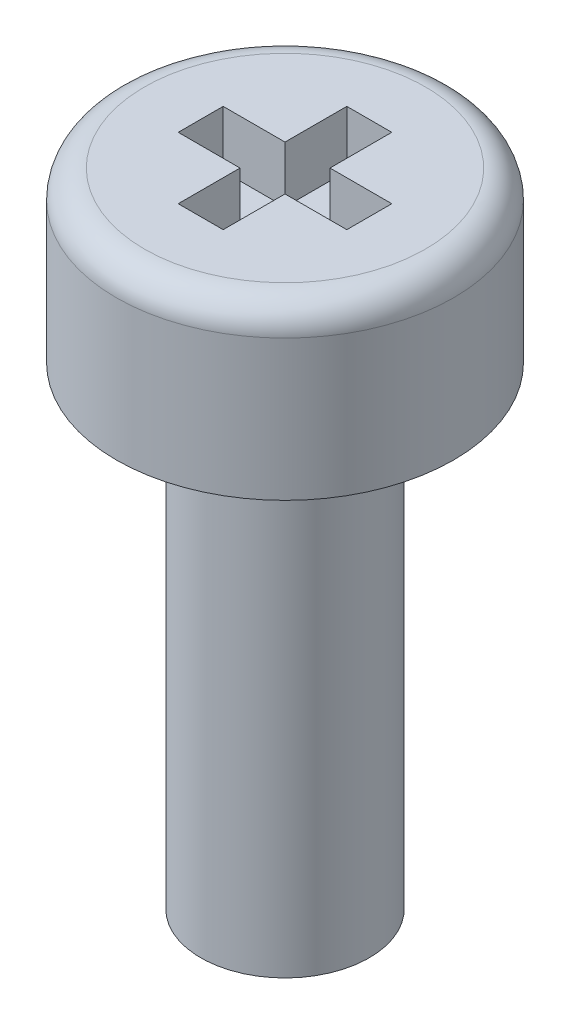
ISO-10303-21;
HEADER;
FILE_DESCRIPTION(('STEP AP214'),'2;1');
FILE_NAME('part.step','',(''),(''),'','','');
FILE_SCHEMA(('AUTOMOTIVE_DESIGN { 1 0 10303 214 1 1 1 1 }'));
ENDSEC;
DATA;
#1=APPLICATION_CONTEXT('core data for automotive mechanical design processes');
#2=APPLICATION_PROTOCOL_DEFINITION('international standard','automotive_design',2000,#1);
#3=PRODUCT_CONTEXT('',#1,'mechanical');
#4=PRODUCT('Part','Part','',(#3));
#5=PRODUCT_RELATED_PRODUCT_CATEGORY('part','',(#4));
#6=PRODUCT_DEFINITION_FORMATION('','',#4);
#7=PRODUCT_DEFINITION_CONTEXT('part definition',#1,'design');
#8=PRODUCT_DEFINITION('design','',#6,#7);
#9=PRODUCT_DEFINITION_SHAPE('','',#8);
#10=(LENGTH_UNIT() NAMED_UNIT(*) SI_UNIT(.MILLI.,.METRE.));
#11=(NAMED_UNIT(*) PLANE_ANGLE_UNIT() SI_UNIT($,.RADIAN.));
#12=(NAMED_UNIT(*) SI_UNIT($,.STERADIAN.) SOLID_ANGLE_UNIT());
#13=UNCERTAINTY_MEASURE_WITH_UNIT(LENGTH_MEASURE(1.E-05),#10,'distance_accuracy_value','');
#14=(GEOMETRIC_REPRESENTATION_CONTEXT(3) GLOBAL_UNCERTAINTY_ASSIGNED_CONTEXT((#13)) GLOBAL_UNIT_ASSIGNED_CONTEXT((#10,
#11,#12)) REPRESENTATION_CONTEXT('',''));
#15=CARTESIAN_POINT('',(0.,0.,0.));
#16=DIRECTION('',(0.,0.,1.));
#17=DIRECTION('',(1.,0.,0.));
#18=AXIS2_PLACEMENT_3D('',#15,#16,#17);
#19=CARTESIAN_POINT('',(0.,3.,0.));
#20=DIRECTION('',(0.,-1.,0.));
#21=DIRECTION('',(0.,0.,-1.));
#22=AXIS2_PLACEMENT_3D('',#19,#20,#21);
#23=CYLINDRICAL_SURFACE('',#22,3.);
#24=CARTESIAN_POINT('',(0.,2.5,0.));
#25=DIRECTION('',(0.,1.,0.));
#26=DIRECTION('',(0.,0.,1.));
#27=AXIS2_PLACEMENT_3D('',#24,#25,#26);
#28=CIRCLE('',#27,3.);
#29=CARTESIAN_POINT('',(0.,2.5,3.));
#30=VERTEX_POINT('',#29);
#31=EDGE_CURVE('E11',#30,#30,#28,.F.);
#32=ORIENTED_EDGE('',*,*,#31,.T.);
#33=EDGE_LOOP('',(#32));
#34=FACE_BOUND('',#33,.T.);
#35=CARTESIAN_POINT('',(0.,0.,0.));
#36=DIRECTION('',(0.,1.,0.));
#37=DIRECTION('',(0.,0.,1.));
#38=AXIS2_PLACEMENT_3D('',#35,#36,#37);
#39=CIRCLE('',#38,3.);
#40=CARTESIAN_POINT('',(0.,0.,3.));
#41=VERTEX_POINT('',#40);
#42=EDGE_CURVE('E211',#41,#41,#39,.T.);
#43=ORIENTED_EDGE('',*,*,#42,.T.);
#44=EDGE_LOOP('',(#43));
#45=FACE_BOUND('',#44,.T.);
#46=ADVANCED_FACE('F33',(#34,#45),#23,.T.);
#47=CARTESIAN_POINT('',(0.,3.,0.));
#48=DIRECTION('',(0.,1.,0.));
#49=DIRECTION('',(0.,0.,1.));
#50=AXIS2_PLACEMENT_3D('',#47,#48,#49);
#51=PLANE('',#50);
#52=DIRECTION('',(0.,0.,1.));
#53=VECTOR('',#52,1.);
#54=CARTESIAN_POINT('',(-0.4,3.,0.));
#55=LINE('',#54,#53);
#56=CARTESIAN_POINT('',(-0.4,3.,-1.5));
#57=VERTEX_POINT('',#56);
#58=CARTESIAN_POINT('',(-0.4,3.,-0.4));
#59=VERTEX_POINT('',#58);
#60=EDGE_CURVE('E48',#57,#59,#55,.T.);
#61=ORIENTED_EDGE('',*,*,#60,.F.);
#62=DIRECTION('',(-1.,0.,0.));
#63=VECTOR('',#62,1.);
#64=CARTESIAN_POINT('',(0.,3.,-1.5));
#65=LINE('',#64,#63);
#66=CARTESIAN_POINT('',(0.4,3.,-1.5));
#67=VERTEX_POINT('',#66);
#68=EDGE_CURVE('E187',#67,#57,#65,.T.);
#69=ORIENTED_EDGE('',*,*,#68,.F.);
#70=DIRECTION('',(0.,0.,1.));
#71=VECTOR('',#70,1.);
#72=CARTESIAN_POINT('',(0.4,3.,0.));
#73=LINE('',#72,#71);
#74=CARTESIAN_POINT('',(0.4,3.,-0.4));
#75=VERTEX_POINT('',#74);
#76=EDGE_CURVE('E185',#67,#75,#73,.T.);
#77=ORIENTED_EDGE('',*,*,#76,.T.);
#78=DIRECTION('',(1.,0.,0.));
#79=VECTOR('',#78,1.);
#80=CARTESIAN_POINT('',(0.,3.,-0.4));
#81=LINE('',#80,#79);
#82=CARTESIAN_POINT('',(1.5,3.,-0.4));
#83=VERTEX_POINT('',#82);
#84=EDGE_CURVE('E143',#75,#83,#81,.T.);
#85=ORIENTED_EDGE('',*,*,#84,.T.);
#86=DIRECTION('',(0.,0.,1.));
#87=VECTOR('',#86,1.);
#88=CARTESIAN_POINT('',(1.5,3.,0.));
#89=LINE('',#88,#87);
#90=CARTESIAN_POINT('',(1.5,3.,0.4));
#91=VERTEX_POINT('',#90);
#92=EDGE_CURVE('E181',#83,#91,#89,.T.);
#93=ORIENTED_EDGE('',*,*,#92,.T.);
#94=DIRECTION('',(1.,0.,0.));
#95=VECTOR('',#94,1.);
#96=CARTESIAN_POINT('',(0.,3.,0.4));
#97=LINE('',#96,#95);
#98=CARTESIAN_POINT('',(0.4,3.,0.4));
#99=VERTEX_POINT('',#98);
#100=EDGE_CURVE('E178',#99,#91,#97,.T.);
#101=ORIENTED_EDGE('',*,*,#100,.F.);
#102=DIRECTION('',(0.,0.,1.));
#103=VECTOR('',#102,1.);
#104=CARTESIAN_POINT('',(0.4,3.,0.));
#105=LINE('',#104,#103);
#106=CARTESIAN_POINT('',(0.4,3.,1.5));
#107=VERTEX_POINT('',#106);
#108=EDGE_CURVE('E175',#99,#107,#105,.T.);
#109=ORIENTED_EDGE('',*,*,#108,.T.);
#110=DIRECTION('',(-1.,0.,0.));
#111=VECTOR('',#110,1.);
#112=CARTESIAN_POINT('',(0.,3.,1.5));
#113=LINE('',#112,#111);
#114=CARTESIAN_POINT('',(-0.4,3.,1.5));
#115=VERTEX_POINT('',#114);
#116=EDGE_CURVE('E172',#107,#115,#113,.T.);
#117=ORIENTED_EDGE('',*,*,#116,.T.);
#118=DIRECTION('',(0.,0.,1.));
#119=VECTOR('',#118,1.);
#120=CARTESIAN_POINT('',(-0.4,3.,0.));
#121=LINE('',#120,#119);
#122=CARTESIAN_POINT('',(-0.4,3.,0.4));
#123=VERTEX_POINT('',#122);
#124=EDGE_CURVE('E169',#123,#115,#121,.T.);
#125=ORIENTED_EDGE('',*,*,#124,.F.);
#126=DIRECTION('',(1.,0.,0.));
#127=VECTOR('',#126,1.);
#128=CARTESIAN_POINT('',(0.,3.,0.4));
#129=LINE('',#128,#127);
#130=CARTESIAN_POINT('',(-1.5,3.,0.4));
#131=VERTEX_POINT('',#130);
#132=EDGE_CURVE('E166',#131,#123,#129,.T.);
#133=ORIENTED_EDGE('',*,*,#132,.F.);
#134=DIRECTION('',(0.,0.,1.));
#135=VECTOR('',#134,1.);
#136=CARTESIAN_POINT('',(-1.5,3.,0.));
#137=LINE('',#136,#135);
#138=CARTESIAN_POINT('',(-1.5,3.,-0.4));
#139=VERTEX_POINT('',#138);
#140=EDGE_CURVE('E163',#139,#131,#137,.T.);
#141=ORIENTED_EDGE('',*,*,#140,.F.);
#142=DIRECTION('',(1.,0.,0.));
#143=VECTOR('',#142,1.);
#144=CARTESIAN_POINT('',(0.,3.,-0.4));
#145=LINE('',#144,#143);
#146=EDGE_CURVE('E160',#139,#59,#145,.T.);
#147=ORIENTED_EDGE('',*,*,#146,.T.);
#148=EDGE_LOOP('',(#61,#69,#77,#85,#93,#101,#109,#117,#125,#133,#141,#147));
#149=FACE_BOUND('',#148,.T.);
#150=CARTESIAN_POINT('',(0.,3.,0.));
#151=DIRECTION('',(0.,1.,0.));
#152=DIRECTION('',(0.,0.,1.));
#153=AXIS2_PLACEMENT_3D('',#150,#151,#152);
#154=CIRCLE('',#153,2.5);
#155=CARTESIAN_POINT('',(0.,3.,2.5));
#156=VERTEX_POINT('',#155);
#157=EDGE_CURVE('E41',#156,#156,#154,.T.);
#158=ORIENTED_EDGE('',*,*,#157,.T.);
#159=EDGE_LOOP('',(#158));
#160=FACE_BOUND('',#159,.T.);
#161=ADVANCED_FACE('F219',(#149,#160),#51,.T.);
#162=CARTESIAN_POINT('',(0.,0.,0.));
#163=DIRECTION('',(0.,1.,0.));
#164=DIRECTION('',(0.,0.,1.));
#165=AXIS2_PLACEMENT_3D('',#162,#163,#164);
#166=PLANE('',#165);
#167=CARTESIAN_POINT('',(0.,0.,0.));
#168=DIRECTION('',(0.,-1.,0.));
#169=DIRECTION('',(0.,0.,-1.));
#170=AXIS2_PLACEMENT_3D('',#167,#168,#169);
#171=CIRCLE('',#170,1.5);
#172=CARTESIAN_POINT('',(0.,0.,-1.5));
#173=VERTEX_POINT('',#172);
#174=EDGE_CURVE('E212',#173,#173,#171,.T.);
#175=ORIENTED_EDGE('',*,*,#174,.F.);
#176=EDGE_LOOP('',(#175));
#177=FACE_BOUND('',#176,.T.);
#178=ORIENTED_EDGE('',*,*,#42,.F.);
#179=EDGE_LOOP('',(#178));
#180=FACE_BOUND('',#179,.T.);
#181=ADVANCED_FACE('F240',(#177,#180),#166,.F.);
#182=CARTESIAN_POINT('',(0.,-8.42,0.));
#183=DIRECTION('',(0.,1.,0.));
#184=DIRECTION('',(0.,0.,1.));
#185=AXIS2_PLACEMENT_3D('',#182,#183,#184);
#186=CYLINDRICAL_SURFACE('',#185,1.5);
#187=CARTESIAN_POINT('',(0.,-8.42,0.));
#188=DIRECTION('',(0.,-1.,0.));
#189=DIRECTION('',(0.,0.,-1.));
#190=AXIS2_PLACEMENT_3D('',#187,#188,#189);
#191=CIRCLE('',#190,1.5);
#192=CARTESIAN_POINT('',(0.,-8.42,-1.5));
#193=VERTEX_POINT('',#192);
#194=EDGE_CURVE('E191',#193,#193,#191,.T.);
#195=ORIENTED_EDGE('',*,*,#194,.F.);
#196=EDGE_LOOP('',(#195));
#197=FACE_BOUND('',#196,.T.);
#198=ORIENTED_EDGE('',*,*,#174,.T.);
#199=EDGE_LOOP('',(#198));
#200=FACE_BOUND('',#199,.T.);
#201=ADVANCED_FACE('F231',(#197,#200),#186,.T.);
#202=CARTESIAN_POINT('',(0.,-8.42,0.));
#203=DIRECTION('',(0.,-1.,0.));
#204=DIRECTION('',(0.,0.,-1.));
#205=AXIS2_PLACEMENT_3D('',#202,#203,#204);
#206=PLANE('',#205);
#207=ORIENTED_EDGE('',*,*,#194,.T.);
#208=EDGE_LOOP('',(#207));
#209=FACE_BOUND('',#208,.T.);
#210=ADVANCED_FACE('F223',(#209),#206,.T.);
#211=CARTESIAN_POINT('',(0.,2.5,0.));
#212=DIRECTION('',(0.,1.,0.));
#213=DIRECTION('',(0.,0.,1.));
#214=AXIS2_PLACEMENT_3D('',#211,#212,#213);
#215=TOROIDAL_SURFACE('',#214,2.5,0.5);
#216=ORIENTED_EDGE('',*,*,#31,.F.);
#217=EDGE_LOOP('',(#216));
#218=FACE_BOUND('',#217,.T.);
#219=ORIENTED_EDGE('',*,*,#157,.F.);
#220=EDGE_LOOP('',(#219));
#221=FACE_BOUND('',#220,.T.);
#222=ADVANCED_FACE('F35',(#218,#221),#215,.T.);
#223=CARTESIAN_POINT('',(-0.4,2.,0.));
#224=DIRECTION('',(-1.,0.,0.));
#225=DIRECTION('',(0.,0.,1.));
#226=AXIS2_PLACEMENT_3D('',#223,#224,#225);
#227=PLANE('',#226);
#228=ORIENTED_EDGE('',*,*,#60,.T.);
#229=DIRECTION('',(0.,1.,0.));
#230=VECTOR('',#229,1.);
#231=CARTESIAN_POINT('',(-0.4,2.,-0.4));
#232=LINE('',#231,#230);
#233=CARTESIAN_POINT('',(-0.4,2.,-0.4));
#234=VERTEX_POINT('',#233);
#235=EDGE_CURVE('E158',#234,#59,#232,.T.);
#236=ORIENTED_EDGE('',*,*,#235,.F.);
#237=DIRECTION('',(0.,0.,1.));
#238=VECTOR('',#237,1.);
#239=CARTESIAN_POINT('',(-0.4,2.,0.));
#240=LINE('',#239,#238);
#241=CARTESIAN_POINT('',(-0.4,2.,-1.5));
#242=VERTEX_POINT('',#241);
#243=EDGE_CURVE('E189',#242,#234,#240,.T.);
#244=ORIENTED_EDGE('',*,*,#243,.F.);
#245=DIRECTION('',(0.,1.,0.));
#246=VECTOR('',#245,1.);
#247=CARTESIAN_POINT('',(-0.4,2.,-1.5));
#248=LINE('',#247,#246);
#249=EDGE_CURVE('E56',#242,#57,#248,.T.);
#250=ORIENTED_EDGE('',*,*,#249,.T.);
#251=EDGE_LOOP('',(#228,#236,#244,#250));
#252=FACE_BOUND('',#251,.T.);
#253=ADVANCED_FACE('F222',(#252),#227,.F.);
#254=CARTESIAN_POINT('',(0.,2.,-1.5));
#255=DIRECTION('',(0.,0.,-1.));
#256=DIRECTION('',(-1.,0.,0.));
#257=AXIS2_PLACEMENT_3D('',#254,#255,#256);
#258=PLANE('',#257);
#259=ORIENTED_EDGE('',*,*,#68,.T.);
#260=ORIENTED_EDGE('',*,*,#249,.F.);
#261=DIRECTION('',(-1.,0.,0.));
#262=VECTOR('',#261,1.);
#263=CARTESIAN_POINT('',(0.,2.,-1.5));
#264=LINE('',#263,#262);
#265=CARTESIAN_POINT('',(0.4,2.,-1.5));
#266=VERTEX_POINT('',#265);
#267=EDGE_CURVE('E136',#266,#242,#264,.T.);
#268=ORIENTED_EDGE('',*,*,#267,.F.);
#269=DIRECTION('',(0.,1.,0.));
#270=VECTOR('',#269,1.);
#271=CARTESIAN_POINT('',(0.4,2.,-1.5));
#272=LINE('',#271,#270);
#273=EDGE_CURVE('E132',#266,#67,#272,.T.);
#274=ORIENTED_EDGE('',*,*,#273,.T.);
#275=EDGE_LOOP('',(#259,#260,#268,#274));
#276=FACE_BOUND('',#275,.T.);
#277=ADVANCED_FACE('F229',(#276),#258,.F.);
#278=CARTESIAN_POINT('',(0.4,2.,0.));
#279=DIRECTION('',(-1.,0.,0.));
#280=DIRECTION('',(0.,0.,1.));
#281=AXIS2_PLACEMENT_3D('',#278,#279,#280);
#282=PLANE('',#281);
#283=ORIENTED_EDGE('',*,*,#76,.F.);
#284=ORIENTED_EDGE('',*,*,#273,.F.);
#285=DIRECTION('',(0.,0.,1.));
#286=VECTOR('',#285,1.);
#287=CARTESIAN_POINT('',(0.4,2.,0.));
#288=LINE('',#287,#286);
#289=CARTESIAN_POINT('',(0.4,2.,-0.4));
#290=VERTEX_POINT('',#289);
#291=EDGE_CURVE('E126',#266,#290,#288,.T.);
#292=ORIENTED_EDGE('',*,*,#291,.T.);
#293=DIRECTION('',(0.,1.,0.));
#294=VECTOR('',#293,1.);
#295=CARTESIAN_POINT('',(0.4,2.,-0.4));
#296=LINE('',#295,#294);
#297=EDGE_CURVE('E130',#290,#75,#296,.T.);
#298=ORIENTED_EDGE('',*,*,#297,.T.);
#299=EDGE_LOOP('',(#283,#284,#292,#298));
#300=FACE_BOUND('',#299,.T.);
#301=ADVANCED_FACE('F129',(#300),#282,.T.);
#302=CARTESIAN_POINT('',(0.,2.,-0.4));
#303=DIRECTION('',(0.,0.,1.));
#304=DIRECTION('',(1.,0.,0.));
#305=AXIS2_PLACEMENT_3D('',#302,#303,#304);
#306=PLANE('',#305);
#307=ORIENTED_EDGE('',*,*,#84,.F.);
#308=ORIENTED_EDGE('',*,*,#297,.F.);
#309=DIRECTION('',(1.,0.,0.));
#310=VECTOR('',#309,1.);
#311=CARTESIAN_POINT('',(0.,2.,-0.4));
#312=LINE('',#311,#310);
#313=CARTESIAN_POINT('',(1.5,2.,-0.4));
#314=VERTEX_POINT('',#313);
#315=EDGE_CURVE('E137',#290,#314,#312,.T.);
#316=ORIENTED_EDGE('',*,*,#315,.T.);
#317=DIRECTION('',(0.,1.,0.));
#318=VECTOR('',#317,1.);
#319=CARTESIAN_POINT('',(1.5,2.,-0.4));
#320=LINE('',#319,#318);
#321=EDGE_CURVE('E145',#314,#83,#320,.T.);
#322=ORIENTED_EDGE('',*,*,#321,.T.);
#323=EDGE_LOOP('',(#307,#308,#316,#322));
#324=FACE_BOUND('',#323,.T.);
#325=ADVANCED_FACE('F140',(#324),#306,.T.);
#326=CARTESIAN_POINT('',(1.5,2.,0.));
#327=DIRECTION('',(-1.,0.,0.));
#328=DIRECTION('',(0.,0.,1.));
#329=AXIS2_PLACEMENT_3D('',#326,#327,#328);
#330=PLANE('',#329);
#331=ORIENTED_EDGE('',*,*,#92,.F.);
#332=ORIENTED_EDGE('',*,*,#321,.F.);
#333=DIRECTION('',(0.,0.,1.));
#334=VECTOR('',#333,1.);
#335=CARTESIAN_POINT('',(1.5,2.,0.));
#336=LINE('',#335,#334);
#337=CARTESIAN_POINT('',(1.5,2.,0.4));
#338=VERTEX_POINT('',#337);
#339=EDGE_CURVE('E151',#314,#338,#336,.T.);
#340=ORIENTED_EDGE('',*,*,#339,.T.);
#341=DIRECTION('',(0.,1.,0.));
#342=VECTOR('',#341,1.);
#343=CARTESIAN_POINT('',(1.5,2.,0.4));
#344=LINE('',#343,#342);
#345=EDGE_CURVE('E194',#338,#91,#344,.T.);
#346=ORIENTED_EDGE('',*,*,#345,.T.);
#347=EDGE_LOOP('',(#331,#332,#340,#346));
#348=FACE_BOUND('',#347,.T.);
#349=ADVANCED_FACE('F277',(#348),#330,.T.);
#350=CARTESIAN_POINT('',(0.,2.,0.4));
#351=DIRECTION('',(0.,0.,1.));
#352=DIRECTION('',(1.,0.,0.));
#353=AXIS2_PLACEMENT_3D('',#350,#351,#352);
#354=PLANE('',#353);
#355=ORIENTED_EDGE('',*,*,#100,.T.);
#356=ORIENTED_EDGE('',*,*,#345,.F.);
#357=DIRECTION('',(1.,0.,0.));
#358=VECTOR('',#357,1.);
#359=CARTESIAN_POINT('',(0.,2.,0.4));
#360=LINE('',#359,#358);
#361=CARTESIAN_POINT('',(0.4,2.,0.4));
#362=VERTEX_POINT('',#361);
#363=EDGE_CURVE('E153',#362,#338,#360,.T.);
#364=ORIENTED_EDGE('',*,*,#363,.F.);
#365=DIRECTION('',(0.,1.,0.));
#366=VECTOR('',#365,1.);
#367=CARTESIAN_POINT('',(0.4,2.,0.4));
#368=LINE('',#367,#366);
#369=EDGE_CURVE('E196',#362,#99,#368,.T.);
#370=ORIENTED_EDGE('',*,*,#369,.T.);
#371=EDGE_LOOP('',(#355,#356,#364,#370));
#372=FACE_BOUND('',#371,.T.);
#373=ADVANCED_FACE('F273',(#372),#354,.F.);
#374=CARTESIAN_POINT('',(0.4,2.,0.));
#375=DIRECTION('',(-1.,0.,0.));
#376=DIRECTION('',(0.,0.,1.));
#377=AXIS2_PLACEMENT_3D('',#374,#375,#376);
#378=PLANE('',#377);
#379=ORIENTED_EDGE('',*,*,#108,.F.);
#380=ORIENTED_EDGE('',*,*,#369,.F.);
#381=DIRECTION('',(0.,0.,1.));
#382=VECTOR('',#381,1.);
#383=CARTESIAN_POINT('',(0.4,2.,0.));
#384=LINE('',#383,#382);
#385=CARTESIAN_POINT('',(0.4,2.,1.5));
#386=VERTEX_POINT('',#385);
#387=EDGE_CURVE('E427',#362,#386,#384,.T.);
#388=ORIENTED_EDGE('',*,*,#387,.T.);
#389=DIRECTION('',(0.,1.,0.));
#390=VECTOR('',#389,1.);
#391=CARTESIAN_POINT('',(0.4,2.,1.5));
#392=LINE('',#391,#390);
#393=EDGE_CURVE('E198',#386,#107,#392,.T.);
#394=ORIENTED_EDGE('',*,*,#393,.T.);
#395=EDGE_LOOP('',(#379,#380,#388,#394));
#396=FACE_BOUND('',#395,.T.);
#397=ADVANCED_FACE('F269',(#396),#378,.T.);
#398=CARTESIAN_POINT('',(0.,2.,1.5));
#399=DIRECTION('',(0.,0.,-1.));
#400=DIRECTION('',(-1.,0.,0.));
#401=AXIS2_PLACEMENT_3D('',#398,#399,#400);
#402=PLANE('',#401);
#403=ORIENTED_EDGE('',*,*,#116,.F.);
#404=ORIENTED_EDGE('',*,*,#393,.F.);
#405=DIRECTION('',(-1.,0.,0.));
#406=VECTOR('',#405,1.);
#407=CARTESIAN_POINT('',(0.,2.,1.5));
#408=LINE('',#407,#406);
#409=CARTESIAN_POINT('',(-0.4,2.,1.5));
#410=VERTEX_POINT('',#409);
#411=EDGE_CURVE('E425',#386,#410,#408,.T.);
#412=ORIENTED_EDGE('',*,*,#411,.T.);
#413=DIRECTION('',(0.,1.,0.));
#414=VECTOR('',#413,1.);
#415=CARTESIAN_POINT('',(-0.4,2.,1.5));
#416=LINE('',#415,#414);
#417=EDGE_CURVE('E200',#410,#115,#416,.T.);
#418=ORIENTED_EDGE('',*,*,#417,.T.);
#419=EDGE_LOOP('',(#403,#404,#412,#418));
#420=FACE_BOUND('',#419,.T.);
#421=ADVANCED_FACE('F265',(#420),#402,.T.);
#422=CARTESIAN_POINT('',(-0.4,2.,0.));
#423=DIRECTION('',(-1.,0.,0.));
#424=DIRECTION('',(0.,0.,1.));
#425=AXIS2_PLACEMENT_3D('',#422,#423,#424);
#426=PLANE('',#425);
#427=ORIENTED_EDGE('',*,*,#124,.T.);
#428=ORIENTED_EDGE('',*,*,#417,.F.);
#429=DIRECTION('',(0.,0.,1.));
#430=VECTOR('',#429,1.);
#431=CARTESIAN_POINT('',(-0.4,2.,0.));
#432=LINE('',#431,#430);
#433=CARTESIAN_POINT('',(-0.4,2.,0.4));
#434=VERTEX_POINT('',#433);
#435=EDGE_CURVE('E422',#434,#410,#432,.T.);
#436=ORIENTED_EDGE('',*,*,#435,.F.);
#437=DIRECTION('',(0.,1.,0.));
#438=VECTOR('',#437,1.);
#439=CARTESIAN_POINT('',(-0.4,2.,0.4));
#440=LINE('',#439,#438);
#441=EDGE_CURVE('E202',#434,#123,#440,.T.);
#442=ORIENTED_EDGE('',*,*,#441,.T.);
#443=EDGE_LOOP('',(#427,#428,#436,#442));
#444=FACE_BOUND('',#443,.T.);
#445=ADVANCED_FACE('F261',(#444),#426,.F.);
#446=CARTESIAN_POINT('',(0.,2.,0.4));
#447=DIRECTION('',(0.,0.,1.));
#448=DIRECTION('',(1.,0.,0.));
#449=AXIS2_PLACEMENT_3D('',#446,#447,#448);
#450=PLANE('',#449);
#451=ORIENTED_EDGE('',*,*,#132,.T.);
#452=ORIENTED_EDGE('',*,*,#441,.F.);
#453=DIRECTION('',(1.,0.,0.));
#454=VECTOR('',#453,1.);
#455=CARTESIAN_POINT('',(0.,2.,0.4));
#456=LINE('',#455,#454);
#457=CARTESIAN_POINT('',(-1.5,2.,0.4));
#458=VERTEX_POINT('',#457);
#459=EDGE_CURVE('E419',#458,#434,#456,.T.);
#460=ORIENTED_EDGE('',*,*,#459,.F.);
#461=DIRECTION('',(0.,1.,0.));
#462=VECTOR('',#461,1.);
#463=CARTESIAN_POINT('',(-1.5,2.,0.4));
#464=LINE('',#463,#462);
#465=EDGE_CURVE('E204',#458,#131,#464,.T.);
#466=ORIENTED_EDGE('',*,*,#465,.T.);
#467=EDGE_LOOP('',(#451,#452,#460,#466));
#468=FACE_BOUND('',#467,.T.);
#469=ADVANCED_FACE('F257',(#468),#450,.F.);
#470=CARTESIAN_POINT('',(-1.5,2.,0.));
#471=DIRECTION('',(-1.,0.,0.));
#472=DIRECTION('',(0.,0.,1.));
#473=AXIS2_PLACEMENT_3D('',#470,#471,#472);
#474=PLANE('',#473);
#475=ORIENTED_EDGE('',*,*,#140,.T.);
#476=ORIENTED_EDGE('',*,*,#465,.F.);
#477=DIRECTION('',(0.,0.,1.));
#478=VECTOR('',#477,1.);
#479=CARTESIAN_POINT('',(-1.5,2.,0.));
#480=LINE('',#479,#478);
#481=CARTESIAN_POINT('',(-1.5,2.,-0.4));
#482=VERTEX_POINT('',#481);
#483=EDGE_CURVE('E415',#482,#458,#480,.T.);
#484=ORIENTED_EDGE('',*,*,#483,.F.);
#485=DIRECTION('',(0.,1.,0.));
#486=VECTOR('',#485,1.);
#487=CARTESIAN_POINT('',(-1.5,2.,-0.4));
#488=LINE('',#487,#486);
#489=EDGE_CURVE('E206',#482,#139,#488,.T.);
#490=ORIENTED_EDGE('',*,*,#489,.T.);
#491=EDGE_LOOP('',(#475,#476,#484,#490));
#492=FACE_BOUND('',#491,.T.);
#493=ADVANCED_FACE('F254',(#492),#474,.F.);
#494=CARTESIAN_POINT('',(0.,2.,-0.4));
#495=DIRECTION('',(0.,0.,1.));
#496=DIRECTION('',(1.,0.,0.));
#497=AXIS2_PLACEMENT_3D('',#494,#495,#496);
#498=PLANE('',#497);
#499=ORIENTED_EDGE('',*,*,#146,.F.);
#500=ORIENTED_EDGE('',*,*,#489,.F.);
#501=DIRECTION('',(1.,0.,0.));
#502=VECTOR('',#501,1.);
#503=CARTESIAN_POINT('',(0.,2.,-0.4));
#504=LINE('',#503,#502);
#505=EDGE_CURVE('E100',#482,#234,#504,.T.);
#506=ORIENTED_EDGE('',*,*,#505,.T.);
#507=ORIENTED_EDGE('',*,*,#235,.T.);
#508=EDGE_LOOP('',(#499,#500,#506,#507));
#509=FACE_BOUND('',#508,.T.);
#510=ADVANCED_FACE('F251',(#509),#498,.T.);
#511=CARTESIAN_POINT('',(0.,2.,0.));
#512=DIRECTION('',(0.,1.,0.));
#513=DIRECTION('',(0.,0.,1.));
#514=AXIS2_PLACEMENT_3D('',#511,#512,#513);
#515=PLANE('',#514);
#516=ORIENTED_EDGE('',*,*,#243,.T.);
#517=ORIENTED_EDGE('',*,*,#505,.F.);
#518=ORIENTED_EDGE('',*,*,#483,.T.);
#519=ORIENTED_EDGE('',*,*,#459,.T.);
#520=ORIENTED_EDGE('',*,*,#435,.T.);
#521=ORIENTED_EDGE('',*,*,#411,.F.);
#522=ORIENTED_EDGE('',*,*,#387,.F.);
#523=ORIENTED_EDGE('',*,*,#363,.T.);
#524=ORIENTED_EDGE('',*,*,#339,.F.);
#525=ORIENTED_EDGE('',*,*,#315,.F.);
#526=ORIENTED_EDGE('',*,*,#291,.F.);
#527=ORIENTED_EDGE('',*,*,#267,.T.);
#528=EDGE_LOOP('',(#516,#517,#518,#519,#520,#521,#522,#523,#524,#525,#526,#527));
#529=FACE_BOUND('',#528,.T.);
#530=ADVANCED_FACE('F149',(#529),#515,.T.);
#531=CLOSED_SHELL('',(#46,#161,#181,#201,#210,#222,#253,#277,#301,#325,#349,#373,#397,#421,#445,
#469,#493,#510,#530));
#532=MANIFOLD_SOLID_BREP('B2',#531);
#533=ADVANCED_BREP_SHAPE_REPRESENTATION('',(#18,#532),#14);
#534=SHAPE_DEFINITION_REPRESENTATION(#9,#533);
ENDSEC;
END-ISO-10303-21;
